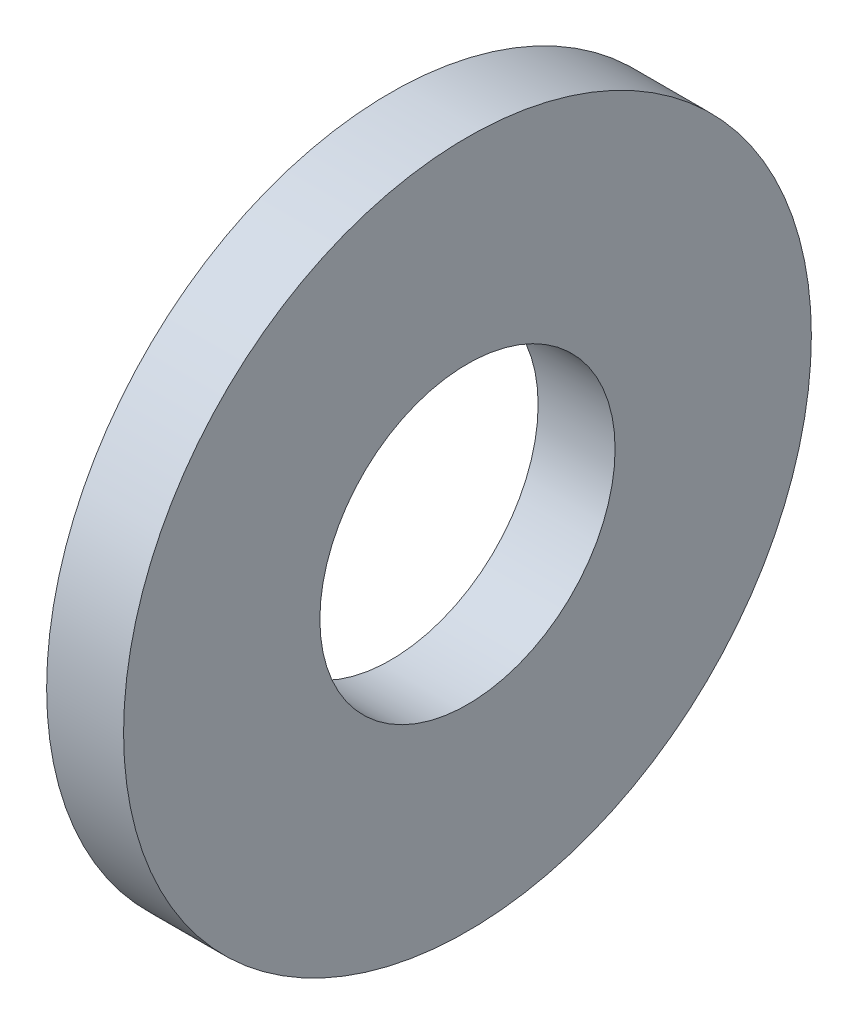
ISO-10303-21;
HEADER;
FILE_DESCRIPTION(('STEP AP214'),'2;1');
FILE_NAME('part.step','',(''),(''),'','','');
FILE_SCHEMA(('AUTOMOTIVE_DESIGN { 1 0 10303 214 1 1 1 1 }'));
ENDSEC;
DATA;
#1=APPLICATION_CONTEXT('core data for automotive mechanical design processes');
#2=APPLICATION_PROTOCOL_DEFINITION('international standard','automotive_design',2000,#1);
#3=PRODUCT_CONTEXT('',#1,'mechanical');
#4=PRODUCT('Part','Part','',(#3));
#5=PRODUCT_RELATED_PRODUCT_CATEGORY('part','',(#4));
#6=PRODUCT_DEFINITION_FORMATION('','',#4);
#7=PRODUCT_DEFINITION_CONTEXT('part definition',#1,'design');
#8=PRODUCT_DEFINITION('design','',#6,#7);
#9=PRODUCT_DEFINITION_SHAPE('','',#8);
#10=(LENGTH_UNIT() NAMED_UNIT(*) SI_UNIT(.MILLI.,.METRE.));
#11=(NAMED_UNIT(*) PLANE_ANGLE_UNIT() SI_UNIT($,.RADIAN.));
#12=(NAMED_UNIT(*) SI_UNIT($,.STERADIAN.) SOLID_ANGLE_UNIT());
#13=UNCERTAINTY_MEASURE_WITH_UNIT(LENGTH_MEASURE(1.E-05),#10,'distance_accuracy_value','');
#14=(GEOMETRIC_REPRESENTATION_CONTEXT(3) GLOBAL_UNCERTAINTY_ASSIGNED_CONTEXT((#13)) GLOBAL_UNIT_ASSIGNED_CONTEXT((#10,
#11,#12)) REPRESENTATION_CONTEXT('',''));
#15=CARTESIAN_POINT('',(0.,0.,0.));
#16=DIRECTION('',(0.,0.,1.));
#17=DIRECTION('',(1.,0.,0.));
#18=AXIS2_PLACEMENT_3D('',#15,#16,#17);
#19=CARTESIAN_POINT('',(-34.9249999999999,0.,0.));
#20=DIRECTION('',(-1.,0.,0.));
#21=DIRECTION('',(0.,0.,1.));
#22=AXIS2_PLACEMENT_3D('',#19,#20,#21);
#23=CYLINDRICAL_SURFACE('',#22,2.3876);
#24=CARTESIAN_POINT('',(0.,0.,0.));
#25=DIRECTION('',(-1.,0.,0.));
#26=DIRECTION('',(0.,0.,1.));
#27=AXIS2_PLACEMENT_3D('',#24,#25,#26);
#28=CIRCLE('',#27,2.3876);
#29=CARTESIAN_POINT('',(0.,0.,2.3876));
#30=VERTEX_POINT('',#29);
#31=EDGE_CURVE('E10',#30,#30,#28,.T.);
#32=ORIENTED_EDGE('',*,*,#31,.F.);
#33=EDGE_LOOP('',(#32));
#34=FACE_BOUND('',#33,.T.);
#35=CARTESIAN_POINT('',(-1.2446,0.,0.));
#36=DIRECTION('',(-1.,0.,0.));
#37=DIRECTION('',(0.,0.,1.));
#38=AXIS2_PLACEMENT_3D('',#35,#36,#37);
#39=CIRCLE('',#38,2.3876);
#40=CARTESIAN_POINT('',(-1.2446,0.,2.3876));
#41=VERTEX_POINT('',#40);
#42=EDGE_CURVE('E42',#41,#41,#39,.T.);
#43=ORIENTED_EDGE('',*,*,#42,.T.);
#44=EDGE_LOOP('',(#43));
#45=FACE_BOUND('',#44,.T.);
#46=ADVANCED_FACE('F28',(#34,#45),#23,.F.);
#47=CARTESIAN_POINT('',(0.,2.3876,0.));
#48=DIRECTION('',(-1.,0.,0.));
#49=DIRECTION('',(0.,0.,1.));
#50=AXIS2_PLACEMENT_3D('',#47,#48,#49);
#51=PLANE('',#50);
#52=CARTESIAN_POINT('',(0.,0.,0.));
#53=DIRECTION('',(-1.,0.,0.));
#54=DIRECTION('',(0.,0.,1.));
#55=AXIS2_PLACEMENT_3D('',#52,#53,#54);
#56=CIRCLE('',#55,5.5626);
#57=CARTESIAN_POINT('',(0.,0.,5.5626));
#58=VERTEX_POINT('',#57);
#59=EDGE_CURVE('E34',#58,#58,#56,.T.);
#60=ORIENTED_EDGE('',*,*,#59,.F.);
#61=EDGE_LOOP('',(#60));
#62=FACE_BOUND('',#61,.T.);
#63=ORIENTED_EDGE('',*,*,#31,.T.);
#64=EDGE_LOOP('',(#63));
#65=FACE_BOUND('',#64,.T.);
#66=ADVANCED_FACE('F57',(#62,#65),#51,.F.);
#67=CARTESIAN_POINT('',(-34.9249999999999,0.,0.));
#68=DIRECTION('',(-1.,0.,0.));
#69=DIRECTION('',(0.,0.,1.));
#70=AXIS2_PLACEMENT_3D('',#67,#68,#69);
#71=CYLINDRICAL_SURFACE('',#70,5.5626);
#72=CARTESIAN_POINT('',(-1.2446,0.,0.));
#73=DIRECTION('',(-1.,0.,0.));
#74=DIRECTION('',(0.,0.,1.));
#75=AXIS2_PLACEMENT_3D('',#72,#73,#74);
#76=CIRCLE('',#75,5.5626);
#77=CARTESIAN_POINT('',(-1.2446,0.,5.5626));
#78=VERTEX_POINT('',#77);
#79=EDGE_CURVE('E38',#78,#78,#76,.T.);
#80=ORIENTED_EDGE('',*,*,#79,.F.);
#81=EDGE_LOOP('',(#80));
#82=FACE_BOUND('',#81,.T.);
#83=ORIENTED_EDGE('',*,*,#59,.T.);
#84=EDGE_LOOP('',(#83));
#85=FACE_BOUND('',#84,.T.);
#86=ADVANCED_FACE('F52',(#82,#85),#71,.T.);
#87=CARTESIAN_POINT('',(-1.2446,5.5626,0.));
#88=DIRECTION('',(1.,0.,0.));
#89=DIRECTION('',(0.,0.,-1.));
#90=AXIS2_PLACEMENT_3D('',#87,#88,#89);
#91=PLANE('',#90);
#92=ORIENTED_EDGE('',*,*,#42,.F.);
#93=EDGE_LOOP('',(#92));
#94=FACE_BOUND('',#93,.T.);
#95=ORIENTED_EDGE('',*,*,#79,.T.);
#96=EDGE_LOOP('',(#95));
#97=FACE_BOUND('',#96,.T.);
#98=ADVANCED_FACE('F49',(#94,#97),#91,.F.);
#99=CLOSED_SHELL('',(#46,#66,#86,#98));
#100=MANIFOLD_SOLID_BREP('B2',#99);
#101=ADVANCED_BREP_SHAPE_REPRESENTATION('',(#18,#100),#14);
#102=SHAPE_DEFINITION_REPRESENTATION(#9,#101);
ENDSEC;
END-ISO-10303-21;
